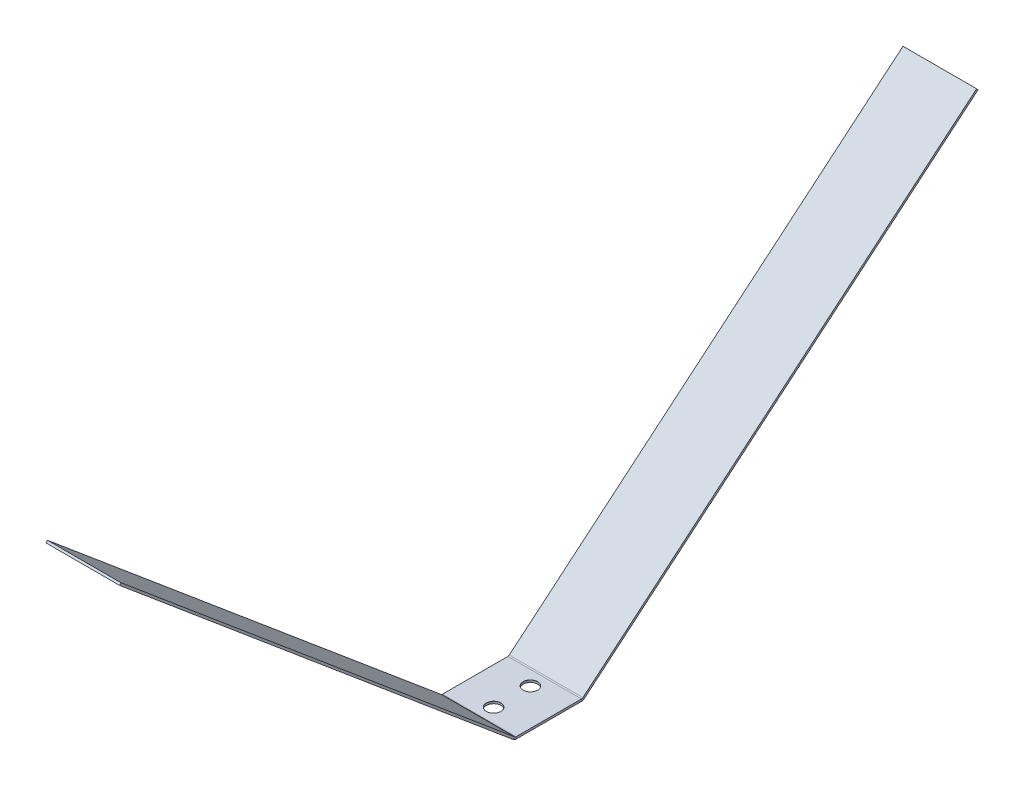
ISO-10303-21;
HEADER;
FILE_DESCRIPTION(('STEP AP214'),'2;1');
FILE_NAME('part.step','',(''),(''),'','','');
FILE_SCHEMA(('AUTOMOTIVE_DESIGN { 1 0 10303 214 1 1 1 1 }'));
ENDSEC;
DATA;
#1=APPLICATION_CONTEXT('core data for automotive mechanical design processes');
#2=APPLICATION_PROTOCOL_DEFINITION('international standard','automotive_design',2000,#1);
#3=PRODUCT_CONTEXT('',#1,'mechanical');
#4=PRODUCT('Part','Part','',(#3));
#5=PRODUCT_RELATED_PRODUCT_CATEGORY('part','',(#4));
#6=PRODUCT_DEFINITION_FORMATION('','',#4);
#7=PRODUCT_DEFINITION_CONTEXT('part definition',#1,'design');
#8=PRODUCT_DEFINITION('design','',#6,#7);
#9=PRODUCT_DEFINITION_SHAPE('','',#8);
#10=(LENGTH_UNIT() NAMED_UNIT(*) SI_UNIT(.MILLI.,.METRE.));
#11=(NAMED_UNIT(*) PLANE_ANGLE_UNIT() SI_UNIT($,.RADIAN.));
#12=(NAMED_UNIT(*) SI_UNIT($,.STERADIAN.) SOLID_ANGLE_UNIT());
#13=UNCERTAINTY_MEASURE_WITH_UNIT(LENGTH_MEASURE(1.E-05),#10,'distance_accuracy_value','');
#14=(GEOMETRIC_REPRESENTATION_CONTEXT(3) GLOBAL_UNCERTAINTY_ASSIGNED_CONTEXT((#13)) GLOBAL_UNIT_ASSIGNED_CONTEXT((#10,
#11,#12)) REPRESENTATION_CONTEXT('',''));
#15=CARTESIAN_POINT('',(0.,0.,0.));
#16=DIRECTION('',(0.,0.,1.));
#17=DIRECTION('',(1.,0.,0.));
#18=AXIS2_PLACEMENT_3D('',#15,#16,#17);
#19=CARTESIAN_POINT('',(0.,-0.7366,0.));
#20=DIRECTION('',(0.,-1.,0.));
#21=DIRECTION('',(0.,0.,-1.));
#22=AXIS2_PLACEMENT_3D('',#19,#20,#21);
#23=PLANE('',#22);
#24=CARTESIAN_POINT('',(800.1,-0.7366,-107.95));
#25=DIRECTION('',(0.,-1.,0.));
#26=DIRECTION('',(0.,0.,-1.));
#27=AXIS2_PLACEMENT_3D('',#24,#25,#26);
#28=CIRCLE('',#27,2.49999999999995);
#29=CARTESIAN_POINT('',(800.1,-0.7366,-110.45));
#30=VERTEX_POINT('',#29);
#31=EDGE_CURVE('E91',#30,#30,#28,.T.);
#32=ORIENTED_EDGE('',*,*,#31,.F.);
#33=EDGE_LOOP('',(#32));
#34=FACE_BOUND('',#33,.T.);
#35=CARTESIAN_POINT('',(800.1,-0.7366,-95.25));
#36=DIRECTION('',(0.,-1.,0.));
#37=DIRECTION('',(0.,0.,-1.));
#38=AXIS2_PLACEMENT_3D('',#35,#36,#37);
#39=CIRCLE('',#38,2.49999999999995);
#40=CARTESIAN_POINT('',(800.1,-0.7366,-97.7499999999999));
#41=VERTEX_POINT('',#40);
#42=EDGE_CURVE('E200',#41,#41,#39,.T.);
#43=ORIENTED_EDGE('',*,*,#42,.F.);
#44=EDGE_LOOP('',(#43));
#45=FACE_BOUND('',#44,.T.);
#46=DIRECTION('',(0.,0.,-1.));
#47=VECTOR('',#46,1.);
#48=CARTESIAN_POINT('',(812.8,-0.7366,-88.9));
#49=LINE('',#48,#47);
#50=CARTESIAN_POINT('',(812.8,-0.736600000000013,-90.3140466454259));
#51=VERTEX_POINT('',#50);
#52=CARTESIAN_POINT('',(812.8,-0.7366,-112.885953354574));
#53=VERTEX_POINT('',#52);
#54=EDGE_CURVE('E96',#51,#53,#49,.T.);
#55=ORIENTED_EDGE('',*,*,#54,.F.);
#56=DIRECTION('',(1.,0.,0.));
#57=VECTOR('',#56,1.);
#58=CARTESIAN_POINT('',(812.8,-0.736600000000013,-90.3140466454259));
#59=LINE('',#58,#57);
#60=CARTESIAN_POINT('',(787.4,-0.7366,-90.3140466454259));
#61=VERTEX_POINT('',#60);
#62=EDGE_CURVE('E251',#51,#61,#59,.F.);
#63=ORIENTED_EDGE('',*,*,#62,.T.);
#64=DIRECTION('',(0.,0.,1.));
#65=VECTOR('',#64,1.);
#66=CARTESIAN_POINT('',(787.4,-0.7366,-88.9));
#67=LINE('',#66,#65);
#68=CARTESIAN_POINT('',(787.4,-0.736600000000006,-112.885953354574));
#69=VERTEX_POINT('',#68);
#70=EDGE_CURVE('E13',#69,#61,#67,.T.);
#71=ORIENTED_EDGE('',*,*,#70,.F.);
#72=DIRECTION('',(-1.,0.,0.));
#73=VECTOR('',#72,1.);
#74=CARTESIAN_POINT('',(787.4,-0.736600000000006,-112.885953354574));
#75=LINE('',#74,#73);
#76=EDGE_CURVE('E111',#69,#53,#75,.F.);
#77=ORIENTED_EDGE('',*,*,#76,.T.);
#78=EDGE_LOOP('',(#55,#63,#71,#77));
#79=FACE_BOUND('',#78,.T.);
#80=ADVANCED_FACE('F87',(#34,#45,#79),#23,.T.);
#81=CARTESIAN_POINT('',(0.,0.,0.));
#82=DIRECTION('',(0.,-1.,0.));
#83=DIRECTION('',(0.,0.,-1.));
#84=AXIS2_PLACEMENT_3D('',#81,#82,#83);
#85=PLANE('',#84);
#86=CARTESIAN_POINT('',(800.1,0.,-107.95));
#87=DIRECTION('',(0.,1.,0.));
#88=DIRECTION('',(0.,0.,1.));
#89=AXIS2_PLACEMENT_3D('',#86,#87,#88);
#90=CIRCLE('',#89,2.525);
#91=CARTESIAN_POINT('',(800.1,0.,-105.425));
#92=VERTEX_POINT('',#91);
#93=EDGE_CURVE('E638',#92,#92,#90,.T.);
#94=ORIENTED_EDGE('',*,*,#93,.F.);
#95=EDGE_LOOP('',(#94));
#96=FACE_BOUND('',#95,.T.);
#97=CARTESIAN_POINT('',(800.1,0.,-95.25));
#98=DIRECTION('',(0.,1.,0.));
#99=DIRECTION('',(0.,0.,1.));
#100=AXIS2_PLACEMENT_3D('',#97,#98,#99);
#101=CIRCLE('',#100,2.525);
#102=CARTESIAN_POINT('',(800.1,0.,-92.725));
#103=VERTEX_POINT('',#102);
#104=EDGE_CURVE('E210',#103,#103,#101,.T.);
#105=ORIENTED_EDGE('',*,*,#104,.F.);
#106=EDGE_LOOP('',(#105));
#107=FACE_BOUND('',#106,.T.);
#108=DIRECTION('',(1.,0.,0.));
#109=VECTOR('',#108,1.);
#110=CARTESIAN_POINT('',(812.8,0.,-90.3140466454259));
#111=LINE('',#110,#109);
#112=CARTESIAN_POINT('',(812.8,0.,-90.3140466454259));
#113=VERTEX_POINT('',#112);
#114=CARTESIAN_POINT('',(787.4,0.,-90.3140466454259));
#115=VERTEX_POINT('',#114);
#116=EDGE_CURVE('E264',#113,#115,#111,.F.);
#117=ORIENTED_EDGE('',*,*,#116,.F.);
#118=DIRECTION('',(0.,0.,-1.));
#119=VECTOR('',#118,1.);
#120=CARTESIAN_POINT('',(812.8,0.,-88.9));
#121=LINE('',#120,#119);
#122=CARTESIAN_POINT('',(812.8,0.,-112.885953354574));
#123=VERTEX_POINT('',#122);
#124=EDGE_CURVE('E194',#113,#123,#121,.T.);
#125=ORIENTED_EDGE('',*,*,#124,.T.);
#126=DIRECTION('',(-1.,0.,0.));
#127=VECTOR('',#126,1.);
#128=CARTESIAN_POINT('',(787.4,0.,-112.885953354574));
#129=LINE('',#128,#127);
#130=CARTESIAN_POINT('',(787.4,0.,-112.885953354574));
#131=VERTEX_POINT('',#130);
#132=EDGE_CURVE('E155',#131,#123,#129,.F.);
#133=ORIENTED_EDGE('',*,*,#132,.F.);
#134=DIRECTION('',(0.,0.,1.));
#135=VECTOR('',#134,1.);
#136=CARTESIAN_POINT('',(787.4,0.,-88.9));
#137=LINE('',#136,#135);
#138=EDGE_CURVE('E196',#131,#115,#137,.T.);
#139=ORIENTED_EDGE('',*,*,#138,.T.);
#140=EDGE_LOOP('',(#117,#125,#133,#139));
#141=FACE_BOUND('',#140,.T.);
#142=ADVANCED_FACE('F323',(#96,#107,#141),#85,.F.);
#143=CARTESIAN_POINT('',(812.8,-0.7366,-88.9));
#144=DIRECTION('',(1.,0.,0.));
#145=DIRECTION('',(0.,0.,-1.));
#146=AXIS2_PLACEMENT_3D('',#143,#144,#145);
#147=PLANE('',#146);
#148=ORIENTED_EDGE('',*,*,#124,.F.);
#149=DIRECTION('',(0.,-1.,0.));
#150=VECTOR('',#149,1.);
#151=CARTESIAN_POINT('',(812.8,0.,-90.3140466454259));
#152=LINE('',#151,#150);
#153=EDGE_CURVE('E258',#113,#51,#152,.T.);
#154=ORIENTED_EDGE('',*,*,#153,.T.);
#155=ORIENTED_EDGE('',*,*,#54,.T.);
#156=DIRECTION('',(0.,-1.,0.));
#157=VECTOR('',#156,1.);
#158=CARTESIAN_POINT('',(812.8,0.,-112.885953354574));
#159=LINE('',#158,#157);
#160=EDGE_CURVE('E191',#123,#53,#159,.T.);
#161=ORIENTED_EDGE('',*,*,#160,.F.);
#162=EDGE_LOOP('',(#148,#154,#155,#161));
#163=FACE_BOUND('',#162,.T.);
#164=ADVANCED_FACE('F89',(#163),#147,.T.);
#165=CARTESIAN_POINT('',(787.4,-0.7366,-88.9));
#166=DIRECTION('',(-1.,0.,0.));
#167=DIRECTION('',(0.,0.,1.));
#168=AXIS2_PLACEMENT_3D('',#165,#166,#167);
#169=PLANE('',#168);
#170=DIRECTION('',(0.,-1.,0.));
#171=VECTOR('',#170,1.);
#172=CARTESIAN_POINT('',(787.4,0.,-90.3140466454259));
#173=LINE('',#172,#171);
#174=EDGE_CURVE('E182',#115,#61,#173,.T.);
#175=ORIENTED_EDGE('',*,*,#174,.F.);
#176=ORIENTED_EDGE('',*,*,#138,.F.);
#177=DIRECTION('',(0.,-1.,0.));
#178=VECTOR('',#177,1.);
#179=CARTESIAN_POINT('',(787.4,0.,-112.885953354574));
#180=LINE('',#179,#178);
#181=EDGE_CURVE('E154',#131,#69,#180,.T.);
#182=ORIENTED_EDGE('',*,*,#181,.T.);
#183=ORIENTED_EDGE('',*,*,#70,.T.);
#184=EDGE_LOOP('',(#175,#176,#182,#183));
#185=FACE_BOUND('',#184,.T.);
#186=ADVANCED_FACE('F336',(#185),#169,.T.);
#187=CARTESIAN_POINT('',(812.8,0.736599999999997,-112.885953354574));
#188=DIRECTION('',(1.,0.,0.));
#189=DIRECTION('',(0.,1.,0.));
#190=AXIS2_PLACEMENT_3D('',#187,#188,#189);
#191=PLANE('',#190);
#192=DIRECTION('',(0.,0.766044443118982,0.642787609686535));
#193=VECTOR('',#192,1.);
#194=CARTESIAN_POINT('',(812.8,-0.391936673602876,-113.832908061164));
#195=LINE('',#194,#193);
#196=CARTESIAN_POINT('',(812.8,0.172331663198554,-113.359430707869));
#197=VERTEX_POINT('',#196);
#198=CARTESIAN_POINT('',(812.8,-0.391936673602889,-113.832908061164));
#199=VERTEX_POINT('',#198);
#200=EDGE_CURVE('E145',#197,#199,#195,.F.);
#201=ORIENTED_EDGE('',*,*,#200,.F.);
#202=CARTESIAN_POINT('',(812.8,0.736599999999997,-112.885953354574));
#203=DIRECTION('',(-1.,0.,0.));
#204=DIRECTION('',(0.,-1.,0.));
#205=AXIS2_PLACEMENT_3D('',#202,#203,#204);
#206=CIRCLE('',#205,0.736600000000002);
#207=EDGE_CURVE('E139',#123,#197,#206,.F.);
#208=ORIENTED_EDGE('',*,*,#207,.F.);
#209=ORIENTED_EDGE('',*,*,#160,.T.);
#210=CARTESIAN_POINT('',(812.8,0.736599999999997,-112.885953354574));
#211=DIRECTION('',(-1.,0.,0.));
#212=DIRECTION('',(0.,-1.,0.));
#213=AXIS2_PLACEMENT_3D('',#210,#211,#212);
#214=CIRCLE('',#213,1.4732);
#215=EDGE_CURVE('E184',#53,#199,#214,.F.);
#216=ORIENTED_EDGE('',*,*,#215,.T.);
#217=EDGE_LOOP('',(#201,#208,#209,#216));
#218=FACE_BOUND('',#217,.T.);
#219=ADVANCED_FACE('F338',(#218),#191,.T.);
#220=CARTESIAN_POINT('',(787.4,0.736599999999995,-112.885953354574));
#221=DIRECTION('',(1.,0.,0.));
#222=DIRECTION('',(0.,1.,0.));
#223=AXIS2_PLACEMENT_3D('',#220,#221,#222);
#224=PLANE('',#223);
#225=CARTESIAN_POINT('',(787.4,0.736599999999995,-112.885953354574));
#226=DIRECTION('',(-1.,0.,0.));
#227=DIRECTION('',(0.,-1.,0.));
#228=AXIS2_PLACEMENT_3D('',#225,#226,#227);
#229=CIRCLE('',#228,0.736600000000002);
#230=CARTESIAN_POINT('',(787.4,0.172331663198552,-113.359430707869));
#231=VERTEX_POINT('',#230);
#232=EDGE_CURVE('E136',#231,#131,#229,.T.);
#233=ORIENTED_EDGE('',*,*,#232,.F.);
#234=DIRECTION('',(0.,0.766044443118982,0.642787609686535));
#235=VECTOR('',#234,1.);
#236=CARTESIAN_POINT('',(787.4,0.172331663198549,-113.359430707869));
#237=LINE('',#236,#235);
#238=CARTESIAN_POINT('',(787.4,-0.391936673602892,-113.832908061164));
#239=VERTEX_POINT('',#238);
#240=EDGE_CURVE('E144',#231,#239,#237,.F.);
#241=ORIENTED_EDGE('',*,*,#240,.T.);
#242=CARTESIAN_POINT('',(787.4,0.736599999999995,-112.885953354574));
#243=DIRECTION('',(-1.,0.,0.));
#244=DIRECTION('',(0.,-1.,0.));
#245=AXIS2_PLACEMENT_3D('',#242,#243,#244);
#246=CIRCLE('',#245,1.4732);
#247=EDGE_CURVE('E185',#239,#69,#246,.T.);
#248=ORIENTED_EDGE('',*,*,#247,.T.);
#249=ORIENTED_EDGE('',*,*,#181,.F.);
#250=EDGE_LOOP('',(#233,#241,#248,#249));
#251=FACE_BOUND('',#250,.T.);
#252=ADVANCED_FACE('F150',(#251),#224,.F.);
#253=CARTESIAN_POINT('',(787.4,0.736599999999995,-112.885953354574));
#254=DIRECTION('',(-1.,0.,0.));
#255=DIRECTION('',(0.,-0.766044443118982,-0.642787609686535));
#256=AXIS2_PLACEMENT_3D('',#253,#254,#255);
#257=CYLINDRICAL_SURFACE('',#256,1.4732);
#258=ORIENTED_EDGE('',*,*,#76,.F.);
#259=ORIENTED_EDGE('',*,*,#247,.F.);
#260=DIRECTION('',(-1.,0.,0.));
#261=VECTOR('',#260,1.);
#262=CARTESIAN_POINT('',(812.8,-0.391936673602896,-113.832908061164));
#263=LINE('',#262,#261);
#264=EDGE_CURVE('E168',#239,#199,#263,.F.);
#265=ORIENTED_EDGE('',*,*,#264,.T.);
#266=ORIENTED_EDGE('',*,*,#215,.F.);
#267=EDGE_LOOP('',(#258,#259,#265,#266));
#268=FACE_BOUND('',#267,.T.);
#269=ADVANCED_FACE('F418',(#268),#257,.T.);
#270=CARTESIAN_POINT('',(787.4,0.736599999999995,-112.885953354574));
#271=DIRECTION('',(-1.,0.,0.));
#272=DIRECTION('',(0.,-0.766044443118982,-0.642787609686535));
#273=AXIS2_PLACEMENT_3D('',#270,#271,#272);
#274=CYLINDRICAL_SURFACE('',#273,0.736600000000002);
#275=ORIENTED_EDGE('',*,*,#132,.T.);
#276=ORIENTED_EDGE('',*,*,#207,.T.);
#277=DIRECTION('',(-1.,0.,0.));
#278=VECTOR('',#277,1.);
#279=CARTESIAN_POINT('',(812.8,0.172331663198555,-113.359430707869));
#280=LINE('',#279,#278);
#281=EDGE_CURVE('E132',#197,#231,#280,.T.);
#282=ORIENTED_EDGE('',*,*,#281,.T.);
#283=ORIENTED_EDGE('',*,*,#232,.T.);
#284=EDGE_LOOP('',(#275,#276,#282,#283));
#285=FACE_BOUND('',#284,.T.);
#286=ADVANCED_FACE('F135',(#285),#274,.F.);
#287=CARTESIAN_POINT('',(787.4,113.551037002266,-249.62485629025));
#288=DIRECTION('',(1.,0.,0.));
#289=DIRECTION('',(0.,0.,-1.));
#290=AXIS2_PLACEMENT_3D('',#287,#288,#289);
#291=PLANE('',#290);
#292=ORIENTED_EDGE('',*,*,#240,.F.);
#293=DIRECTION('',(0.,-0.642787609686535,0.766044443118982));
#294=VECTOR('',#293,1.);
#295=CARTESIAN_POINT('',(787.4,114.115305339067,-249.151378936955));
#296=LINE('',#295,#294);
#297=CARTESIAN_POINT('',(787.4,114.115305339067,-249.151378936955));
#298=VERTEX_POINT('',#297);
#299=EDGE_CURVE('E164',#231,#298,#296,.F.);
#300=ORIENTED_EDGE('',*,*,#299,.T.);
#301=DIRECTION('',(0.,0.766044443118982,0.642787609686535));
#302=VECTOR('',#301,1.);
#303=CARTESIAN_POINT('',(787.4,113.551037002266,-249.62485629025));
#304=LINE('',#303,#302);
#305=CARTESIAN_POINT('',(787.4,113.551037002266,-249.62485629025));
#306=VERTEX_POINT('',#305);
#307=EDGE_CURVE('E156',#306,#298,#304,.T.);
#308=ORIENTED_EDGE('',*,*,#307,.F.);
#309=DIRECTION('',(0.,0.642787609686535,-0.766044443118982));
#310=VECTOR('',#309,1.);
#311=CARTESIAN_POINT('',(787.4,-56.846031421449,-46.553537828764));
#312=LINE('',#311,#310);
#313=EDGE_CURVE('E167',#239,#306,#312,.T.);
#314=ORIENTED_EDGE('',*,*,#313,.F.);
#315=EDGE_LOOP('',(#292,#300,#308,#314));
#316=FACE_BOUND('',#315,.T.);
#317=ADVANCED_FACE('F161',(#316),#291,.F.);
#318=CARTESIAN_POINT('',(812.8,-0.564268336801435,-113.62753118243));
#319=DIRECTION('',(-1.,0.,0.));
#320=DIRECTION('',(0.,0.,1.));
#321=AXIS2_PLACEMENT_3D('',#318,#319,#320);
#322=PLANE('',#321);
#323=ORIENTED_EDGE('',*,*,#200,.T.);
#324=DIRECTION('',(0.,-0.642787609686535,0.766044443118982));
#325=VECTOR('',#324,1.);
#326=CARTESIAN_POINT('',(812.8,-56.846031421449,-46.553537828764));
#327=LINE('',#326,#325);
#328=CARTESIAN_POINT('',(812.8,113.551037002266,-249.62485629025));
#329=VERTEX_POINT('',#328);
#330=EDGE_CURVE('E276',#329,#199,#327,.T.);
#331=ORIENTED_EDGE('',*,*,#330,.F.);
#332=DIRECTION('',(0.,0.766044443118982,0.642787609686535));
#333=VECTOR('',#332,1.);
#334=CARTESIAN_POINT('',(812.8,113.551037002266,-249.62485629025));
#335=LINE('',#334,#333);
#336=CARTESIAN_POINT('',(812.8,114.115305339067,-249.151378936955));
#337=VERTEX_POINT('',#336);
#338=EDGE_CURVE('E273',#329,#337,#335,.T.);
#339=ORIENTED_EDGE('',*,*,#338,.T.);
#340=DIRECTION('',(0.,0.642787609686535,-0.766044443118982));
#341=VECTOR('',#340,1.);
#342=CARTESIAN_POINT('',(812.8,0.,-113.154053829135));
#343=LINE('',#342,#341);
#344=EDGE_CURVE('E175',#337,#197,#343,.F.);
#345=ORIENTED_EDGE('',*,*,#344,.T.);
#346=EDGE_LOOP('',(#323,#331,#339,#345));
#347=FACE_BOUND('',#346,.T.);
#348=ADVANCED_FACE('F283',(#347),#322,.F.);
#349=CARTESIAN_POINT('',(0.,-56.846031421449,-46.553537828764));
#350=DIRECTION('',(0.,0.766044443118982,0.642787609686535));
#351=DIRECTION('',(0.,-0.642787609686535,0.766044443118982));
#352=AXIS2_PLACEMENT_3D('',#349,#350,#351);
#353=PLANE('',#352);
#354=ORIENTED_EDGE('',*,*,#264,.F.);
#355=ORIENTED_EDGE('',*,*,#313,.T.);
#356=DIRECTION('',(1.,0.,0.));
#357=VECTOR('',#356,1.);
#358=CARTESIAN_POINT('',(0.,113.551037002266,-249.62485629025));
#359=LINE('',#358,#357);
#360=EDGE_CURVE('E279',#306,#329,#359,.T.);
#361=ORIENTED_EDGE('',*,*,#360,.T.);
#362=ORIENTED_EDGE('',*,*,#330,.T.);
#363=EDGE_LOOP('',(#354,#355,#361,#362));
#364=FACE_BOUND('',#363,.T.);
#365=ADVANCED_FACE('F306',(#364),#353,.F.);
#366=CARTESIAN_POINT('',(0.,-56.2817630846476,-46.0800604754689));
#367=DIRECTION('',(0.,0.766044443118982,0.642787609686535));
#368=DIRECTION('',(0.,-0.642787609686535,0.766044443118982));
#369=AXIS2_PLACEMENT_3D('',#366,#367,#368);
#370=PLANE('',#369);
#371=ORIENTED_EDGE('',*,*,#299,.F.);
#372=ORIENTED_EDGE('',*,*,#281,.F.);
#373=ORIENTED_EDGE('',*,*,#344,.F.);
#374=DIRECTION('',(-1.,0.,0.));
#375=VECTOR('',#374,1.);
#376=CARTESIAN_POINT('',(812.8,114.115305339067,-249.151378936955));
#377=LINE('',#376,#375);
#378=EDGE_CURVE('E173',#298,#337,#377,.F.);
#379=ORIENTED_EDGE('',*,*,#378,.F.);
#380=EDGE_LOOP('',(#371,#372,#373,#379));
#381=FACE_BOUND('',#380,.T.);
#382=ADVANCED_FACE('F171',(#381),#370,.T.);
#383=CARTESIAN_POINT('',(812.8,113.551037002266,-249.62485629025));
#384=DIRECTION('',(0.,-0.642787609686535,0.766044443118982));
#385=DIRECTION('',(0.,-0.766044443118982,-0.642787609686535));
#386=AXIS2_PLACEMENT_3D('',#383,#384,#385);
#387=PLANE('',#386);
#388=ORIENTED_EDGE('',*,*,#378,.T.);
#389=ORIENTED_EDGE('',*,*,#338,.F.);
#390=ORIENTED_EDGE('',*,*,#360,.F.);
#391=ORIENTED_EDGE('',*,*,#307,.T.);
#392=EDGE_LOOP('',(#388,#389,#390,#391));
#393=FACE_BOUND('',#392,.T.);
#394=ADVANCED_FACE('F307',(#393),#387,.F.);
#395=CARTESIAN_POINT('',(787.4,0.736599999999979,-90.3140466454259));
#396=DIRECTION('',(-1.,0.,0.));
#397=DIRECTION('',(0.,-1.,0.));
#398=AXIS2_PLACEMENT_3D('',#395,#396,#397);
#399=PLANE('',#398);
#400=DIRECTION('',(0.,-0.766044443118982,0.642787609686535));
#401=VECTOR('',#400,1.);
#402=CARTESIAN_POINT('',(787.4,-0.391936673602891,-89.3670919388357));
#403=LINE('',#402,#401);
#404=CARTESIAN_POINT('',(787.4,0.172331663198542,-89.8405692921308));
#405=VERTEX_POINT('',#404);
#406=CARTESIAN_POINT('',(787.4,-0.391936673602897,-89.3670919388357));
#407=VERTEX_POINT('',#406);
#408=EDGE_CURVE('E202',#405,#407,#403,.T.);
#409=ORIENTED_EDGE('',*,*,#408,.F.);
#410=CARTESIAN_POINT('',(787.4,0.736599999999979,-90.3140466454259));
#411=DIRECTION('',(1.,0.,0.));
#412=DIRECTION('',(0.,1.,0.));
#413=AXIS2_PLACEMENT_3D('',#410,#411,#412);
#414=CIRCLE('',#413,0.736599999999994);
#415=EDGE_CURVE('E261',#115,#405,#414,.F.);
#416=ORIENTED_EDGE('',*,*,#415,.F.);
#417=ORIENTED_EDGE('',*,*,#174,.T.);
#418=CARTESIAN_POINT('',(787.4,0.736599999999979,-90.3140466454259));
#419=DIRECTION('',(1.,0.,0.));
#420=DIRECTION('',(0.,1.,0.));
#421=AXIS2_PLACEMENT_3D('',#418,#419,#420);
#422=CIRCLE('',#421,1.47319999999999);
#423=EDGE_CURVE('E254',#61,#407,#422,.F.);
#424=ORIENTED_EDGE('',*,*,#423,.T.);
#425=EDGE_LOOP('',(#409,#416,#417,#424));
#426=FACE_BOUND('',#425,.T.);
#427=ADVANCED_FACE('F309',(#426),#399,.T.);
#428=CARTESIAN_POINT('',(812.8,0.736599999999981,-90.3140466454259));
#429=DIRECTION('',(-1.,0.,0.));
#430=DIRECTION('',(0.,-1.,0.));
#431=AXIS2_PLACEMENT_3D('',#428,#429,#430);
#432=PLANE('',#431);
#433=CARTESIAN_POINT('',(812.8,0.736599999999981,-90.3140466454259));
#434=DIRECTION('',(1.,0.,0.));
#435=DIRECTION('',(0.,1.,0.));
#436=AXIS2_PLACEMENT_3D('',#433,#434,#435);
#437=CIRCLE('',#436,0.736599999999994);
#438=CARTESIAN_POINT('',(812.8,0.172331663198544,-89.8405692921308));
#439=VERTEX_POINT('',#438);
#440=EDGE_CURVE('E221',#439,#113,#437,.T.);
#441=ORIENTED_EDGE('',*,*,#440,.F.);
#442=DIRECTION('',(0.,-0.766044443118982,0.642787609686535));
#443=VECTOR('',#442,1.);
#444=CARTESIAN_POINT('',(812.8,0.172331663198549,-89.8405692921308));
#445=LINE('',#444,#443);
#446=CARTESIAN_POINT('',(812.8,-0.391936673602907,-89.3670919388357));
#447=VERTEX_POINT('',#446);
#448=EDGE_CURVE('E246',#439,#447,#445,.T.);
#449=ORIENTED_EDGE('',*,*,#448,.T.);
#450=CARTESIAN_POINT('',(812.8,0.736599999999981,-90.3140466454259));
#451=DIRECTION('',(1.,0.,0.));
#452=DIRECTION('',(0.,1.,0.));
#453=AXIS2_PLACEMENT_3D('',#450,#451,#452);
#454=CIRCLE('',#453,1.47319999999999);
#455=EDGE_CURVE('E255',#447,#51,#454,.T.);
#456=ORIENTED_EDGE('',*,*,#455,.T.);
#457=ORIENTED_EDGE('',*,*,#153,.F.);
#458=EDGE_LOOP('',(#441,#449,#456,#457));
#459=FACE_BOUND('',#458,.T.);
#460=ADVANCED_FACE('F316',(#459),#432,.F.);
#461=CARTESIAN_POINT('',(812.8,0.736599999999981,-90.3140466454259));
#462=DIRECTION('',(1.,0.,0.));
#463=DIRECTION('',(0.,-0.766044443118982,0.642787609686535));
#464=AXIS2_PLACEMENT_3D('',#461,#462,#463);
#465=CYLINDRICAL_SURFACE('',#464,1.47319999999999);
#466=ORIENTED_EDGE('',*,*,#62,.F.);
#467=ORIENTED_EDGE('',*,*,#455,.F.);
#468=DIRECTION('',(1.,0.,0.));
#469=VECTOR('',#468,1.);
#470=CARTESIAN_POINT('',(787.4,-0.391936673602906,-89.3670919388357));
#471=LINE('',#470,#469);
#472=EDGE_CURVE('E243',#447,#407,#471,.F.);
#473=ORIENTED_EDGE('',*,*,#472,.T.);
#474=ORIENTED_EDGE('',*,*,#423,.F.);
#475=EDGE_LOOP('',(#466,#467,#473,#474));
#476=FACE_BOUND('',#475,.T.);
#477=ADVANCED_FACE('F377',(#476),#465,.T.);
#478=CARTESIAN_POINT('',(812.8,0.736599999999981,-90.3140466454259));
#479=DIRECTION('',(1.,0.,0.));
#480=DIRECTION('',(0.,-0.766044443118982,0.642787609686535));
#481=AXIS2_PLACEMENT_3D('',#478,#479,#480);
#482=CYLINDRICAL_SURFACE('',#481,0.736599999999994);
#483=ORIENTED_EDGE('',*,*,#116,.T.);
#484=ORIENTED_EDGE('',*,*,#415,.T.);
#485=DIRECTION('',(1.,0.,0.));
#486=VECTOR('',#485,1.);
#487=CARTESIAN_POINT('',(787.4,0.172331663198539,-89.8405692921308));
#488=LINE('',#487,#486);
#489=EDGE_CURVE('E207',#405,#439,#488,.T.);
#490=ORIENTED_EDGE('',*,*,#489,.T.);
#491=ORIENTED_EDGE('',*,*,#440,.T.);
#492=EDGE_LOOP('',(#483,#484,#490,#491));
#493=FACE_BOUND('',#492,.T.);
#494=ADVANCED_FACE('F392',(#493),#482,.F.);
#495=CARTESIAN_POINT('',(812.8,-0.564268336801449,-89.5724688175703));
#496=DIRECTION('',(1.,0.,0.));
#497=DIRECTION('',(0.,0.,-1.));
#498=AXIS2_PLACEMENT_3D('',#495,#496,#497);
#499=PLANE('',#498);
#500=DIRECTION('',(0.,0.642787609686535,0.766044443118982));
#501=VECTOR('',#500,1.);
#502=CARTESIAN_POINT('',(812.8,-0.564268336801465,-89.5724688175703));
#503=LINE('',#502,#501);
#504=CARTESIAN_POINT('',(812.8,113.551037002266,46.42485629025));
#505=VERTEX_POINT('',#504);
#506=EDGE_CURVE('E231',#505,#447,#503,.F.);
#507=ORIENTED_EDGE('',*,*,#506,.T.);
#508=ORIENTED_EDGE('',*,*,#448,.F.);
#509=DIRECTION('',(0.,-0.642787609686535,-0.766044443118982));
#510=VECTOR('',#509,1.);
#511=CARTESIAN_POINT('',(812.8,-56.2817630846476,-157.119939524531));
#512=LINE('',#511,#510);
#513=CARTESIAN_POINT('',(812.8,114.115305339067,45.9513789369549));
#514=VERTEX_POINT('',#513);
#515=EDGE_CURVE('E240',#514,#439,#512,.T.);
#516=ORIENTED_EDGE('',*,*,#515,.F.);
#517=DIRECTION('',(0.,0.766044443118982,-0.642787609686535));
#518=VECTOR('',#517,1.);
#519=CARTESIAN_POINT('',(812.8,113.551037002266,46.42485629025));
#520=LINE('',#519,#518);
#521=EDGE_CURVE('E218',#505,#514,#520,.T.);
#522=ORIENTED_EDGE('',*,*,#521,.F.);
#523=EDGE_LOOP('',(#507,#508,#516,#522));
#524=FACE_BOUND('',#523,.T.);
#525=ADVANCED_FACE('F395',(#524),#499,.T.);
#526=CARTESIAN_POINT('',(787.4,113.551037002266,46.42485629025));
#527=DIRECTION('',(-1.,0.,0.));
#528=DIRECTION('',(0.,0.,1.));
#529=AXIS2_PLACEMENT_3D('',#526,#527,#528);
#530=PLANE('',#529);
#531=DIRECTION('',(0.,0.642787609686535,0.766044443118982));
#532=VECTOR('',#531,1.);
#533=CARTESIAN_POINT('',(787.4,-56.2817630846476,-157.119939524531));
#534=LINE('',#533,#532);
#535=CARTESIAN_POINT('',(787.4,114.115305339067,45.9513789369549));
#536=VERTEX_POINT('',#535);
#537=EDGE_CURVE('E234',#405,#536,#534,.T.);
#538=ORIENTED_EDGE('',*,*,#537,.F.);
#539=ORIENTED_EDGE('',*,*,#408,.T.);
#540=DIRECTION('',(0.,-0.642787609686535,-0.766044443118982));
#541=VECTOR('',#540,1.);
#542=CARTESIAN_POINT('',(787.4,113.551037002266,46.42485629025));
#543=LINE('',#542,#541);
#544=CARTESIAN_POINT('',(787.4,113.551037002266,46.42485629025));
#545=VERTEX_POINT('',#544);
#546=EDGE_CURVE('E225',#407,#545,#543,.F.);
#547=ORIENTED_EDGE('',*,*,#546,.T.);
#548=DIRECTION('',(0.,0.766044443118982,-0.642787609686535));
#549=VECTOR('',#548,1.);
#550=CARTESIAN_POINT('',(787.4,113.551037002266,46.42485629025));
#551=LINE('',#550,#549);
#552=EDGE_CURVE('E222',#545,#536,#551,.T.);
#553=ORIENTED_EDGE('',*,*,#552,.T.);
#554=EDGE_LOOP('',(#538,#539,#547,#553));
#555=FACE_BOUND('',#554,.T.);
#556=ADVANCED_FACE('F381',(#555),#530,.T.);
#557=CARTESIAN_POINT('',(0.,-56.846031421449,-156.646462171236));
#558=DIRECTION('',(0.,0.766044443118982,-0.642787609686535));
#559=DIRECTION('',(0.,-0.642787609686535,-0.766044443118982));
#560=AXIS2_PLACEMENT_3D('',#557,#558,#559);
#561=PLANE('',#560);
#562=ORIENTED_EDGE('',*,*,#472,.F.);
#563=ORIENTED_EDGE('',*,*,#506,.F.);
#564=DIRECTION('',(-1.,0.,0.));
#565=VECTOR('',#564,1.);
#566=CARTESIAN_POINT('',(812.8,113.551037002266,46.42485629025));
#567=LINE('',#566,#565);
#568=EDGE_CURVE('E228',#545,#505,#567,.F.);
#569=ORIENTED_EDGE('',*,*,#568,.F.);
#570=ORIENTED_EDGE('',*,*,#546,.F.);
#571=EDGE_LOOP('',(#562,#563,#569,#570));
#572=FACE_BOUND('',#571,.T.);
#573=ADVANCED_FACE('F383',(#572),#561,.F.);
#574=CARTESIAN_POINT('',(0.,-56.2817630846476,-157.119939524531));
#575=DIRECTION('',(0.,0.766044443118982,-0.642787609686535));
#576=DIRECTION('',(0.,-0.642787609686535,-0.766044443118982));
#577=AXIS2_PLACEMENT_3D('',#574,#575,#576);
#578=PLANE('',#577);
#579=ORIENTED_EDGE('',*,*,#515,.T.);
#580=ORIENTED_EDGE('',*,*,#489,.F.);
#581=ORIENTED_EDGE('',*,*,#537,.T.);
#582=DIRECTION('',(1.,0.,0.));
#583=VECTOR('',#582,1.);
#584=CARTESIAN_POINT('',(0.,114.115305339067,45.9513789369549));
#585=LINE('',#584,#583);
#586=EDGE_CURVE('E237',#536,#514,#585,.T.);
#587=ORIENTED_EDGE('',*,*,#586,.T.);
#588=EDGE_LOOP('',(#579,#580,#581,#587));
#589=FACE_BOUND('',#588,.T.);
#590=ADVANCED_FACE('F389',(#589),#578,.T.);
#591=CARTESIAN_POINT('',(812.8,113.551037002266,46.42485629025));
#592=DIRECTION('',(0.,0.642787609686535,0.766044443118982));
#593=DIRECTION('',(0.,-0.766044443118982,0.642787609686535));
#594=AXIS2_PLACEMENT_3D('',#591,#592,#593);
#595=PLANE('',#594);
#596=ORIENTED_EDGE('',*,*,#586,.F.);
#597=ORIENTED_EDGE('',*,*,#552,.F.);
#598=ORIENTED_EDGE('',*,*,#568,.T.);
#599=ORIENTED_EDGE('',*,*,#521,.T.);
#600=EDGE_LOOP('',(#596,#597,#598,#599));
#601=FACE_BOUND('',#600,.T.);
#602=ADVANCED_FACE('F386',(#601),#595,.T.);
#603=CARTESIAN_POINT('',(800.1,0.,-95.25));
#604=DIRECTION('',(0.,1.,0.));
#605=DIRECTION('',(0.,0.,1.));
#606=AXIS2_PLACEMENT_3D('',#603,#604,#605);
#607=CYLINDRICAL_SURFACE('',#606,2.49999999999995);
#608=ORIENTED_EDGE('',*,*,#42,.T.);
#609=EDGE_LOOP('',(#608));
#610=FACE_BOUND('',#609,.T.);
#611=CARTESIAN_POINT('',(800.1,-0.0250000000000077,-95.25));
#612=DIRECTION('',(0.,1.,0.));
#613=DIRECTION('',(0.,0.,1.));
#614=AXIS2_PLACEMENT_3D('',#611,#612,#613);
#615=CIRCLE('',#614,2.49999999999995);
#616=CARTESIAN_POINT('',(800.1,-0.0250000000000077,-92.7500000000001));
#617=VERTEX_POINT('',#616);
#618=EDGE_CURVE('E203',#617,#617,#615,.T.);
#619=ORIENTED_EDGE('',*,*,#618,.T.);
#620=EDGE_LOOP('',(#619));
#621=FACE_BOUND('',#620,.T.);
#622=ADVANCED_FACE('F539',(#610,#621),#607,.F.);
#623=CARTESIAN_POINT('',(800.1,0.,-95.25));
#624=DIRECTION('',(0.,1.,0.));
#625=DIRECTION('',(0.,0.,1.));
#626=AXIS2_PLACEMENT_3D('',#623,#624,#625);
#627=CONICAL_SURFACE('',#626,2.525,0.78539816339835);
#628=ORIENTED_EDGE('',*,*,#618,.F.);
#629=EDGE_LOOP('',(#628));
#630=FACE_BOUND('',#629,.T.);
#631=ORIENTED_EDGE('',*,*,#104,.T.);
#632=EDGE_LOOP('',(#631));
#633=FACE_BOUND('',#632,.T.);
#634=ADVANCED_FACE('F549',(#630,#633),#627,.F.);
#635=CARTESIAN_POINT('',(800.1,0.,-107.95));
#636=DIRECTION('',(0.,1.,0.));
#637=DIRECTION('',(0.,0.,1.));
#638=AXIS2_PLACEMENT_3D('',#635,#636,#637);
#639=CYLINDRICAL_SURFACE('',#638,2.49999999999995);
#640=ORIENTED_EDGE('',*,*,#31,.T.);
#641=EDGE_LOOP('',(#640));
#642=FACE_BOUND('',#641,.T.);
#643=CARTESIAN_POINT('',(800.1,-0.0250000000000077,-107.95));
#644=DIRECTION('',(0.,1.,0.));
#645=DIRECTION('',(0.,0.,1.));
#646=AXIS2_PLACEMENT_3D('',#643,#644,#645);
#647=CIRCLE('',#646,2.49999999999995);
#648=CARTESIAN_POINT('',(800.1,-0.0250000000000077,-105.45));
#649=VERTEX_POINT('',#648);
#650=EDGE_CURVE('E635',#649,#649,#647,.T.);
#651=ORIENTED_EDGE('',*,*,#650,.T.);
#652=EDGE_LOOP('',(#651));
#653=FACE_BOUND('',#652,.T.);
#654=ADVANCED_FACE('F557',(#642,#653),#639,.F.);
#655=CARTESIAN_POINT('',(800.1,0.,-107.95));
#656=DIRECTION('',(0.,1.,0.));
#657=DIRECTION('',(0.,0.,1.));
#658=AXIS2_PLACEMENT_3D('',#655,#656,#657);
#659=CONICAL_SURFACE('',#658,2.525,0.78539816339835);
#660=ORIENTED_EDGE('',*,*,#650,.F.);
#661=EDGE_LOOP('',(#660));
#662=FACE_BOUND('',#661,.T.);
#663=ORIENTED_EDGE('',*,*,#93,.T.);
#664=EDGE_LOOP('',(#663));
#665=FACE_BOUND('',#664,.T.);
#666=ADVANCED_FACE('F566',(#662,#665),#659,.F.);
#667=CLOSED_SHELL('',(#80,#142,#164,#186,#219,#252,#269,#286,#317,#348,#365,#382,#394,#427,#460,
#477,#494,#525,#556,#573,#590,#602,#622,#634,#654,#666));
#668=MANIFOLD_SOLID_BREP('B2',#667);
#669=ADVANCED_BREP_SHAPE_REPRESENTATION('',(#18,#668),#14);
#670=SHAPE_DEFINITION_REPRESENTATION(#9,#669);
ENDSEC;
END-ISO-10303-21;
